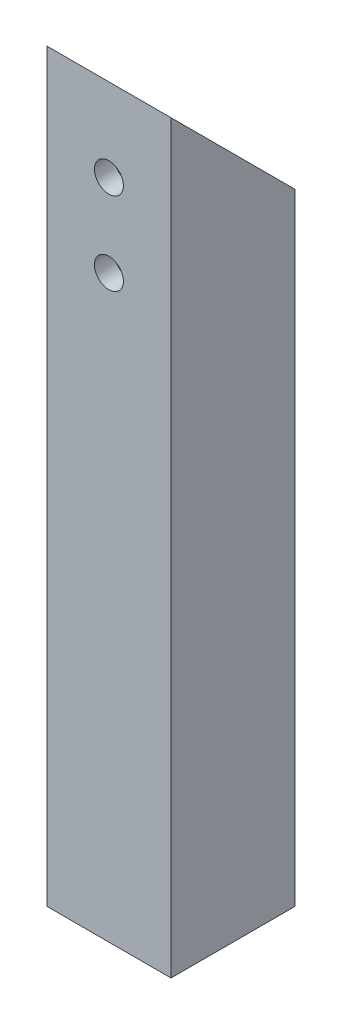
ISO-10303-21;
HEADER;
FILE_DESCRIPTION(('STEP AP214'),'2;1');
FILE_NAME('part.step','',(''),(''),'','','');
FILE_SCHEMA(('AUTOMOTIVE_DESIGN { 1 0 10303 214 1 1 1 1 }'));
ENDSEC;
DATA;
#1=APPLICATION_CONTEXT('core data for automotive mechanical design processes');
#2=APPLICATION_PROTOCOL_DEFINITION('international standard','automotive_design',2000,#1);
#3=PRODUCT_CONTEXT('',#1,'mechanical');
#4=PRODUCT('Part','Part','',(#3));
#5=PRODUCT_RELATED_PRODUCT_CATEGORY('part','',(#4));
#6=PRODUCT_DEFINITION_FORMATION('','',#4);
#7=PRODUCT_DEFINITION_CONTEXT('part definition',#1,'design');
#8=PRODUCT_DEFINITION('design','',#6,#7);
#9=PRODUCT_DEFINITION_SHAPE('','',#8);
#10=(LENGTH_UNIT() NAMED_UNIT(*) SI_UNIT(.MILLI.,.METRE.));
#11=(NAMED_UNIT(*) PLANE_ANGLE_UNIT() SI_UNIT($,.RADIAN.));
#12=(NAMED_UNIT(*) SI_UNIT($,.STERADIAN.) SOLID_ANGLE_UNIT());
#13=UNCERTAINTY_MEASURE_WITH_UNIT(LENGTH_MEASURE(1.E-05),#10,'distance_accuracy_value','');
#14=(GEOMETRIC_REPRESENTATION_CONTEXT(3) GLOBAL_UNCERTAINTY_ASSIGNED_CONTEXT((#13)) GLOBAL_UNIT_ASSIGNED_CONTEXT((#10,
#11,#12)) REPRESENTATION_CONTEXT('',''));
#15=CARTESIAN_POINT('',(0.,0.,0.));
#16=DIRECTION('',(0.,0.,1.));
#17=DIRECTION('',(1.,0.,0.));
#18=AXIS2_PLACEMENT_3D('',#15,#16,#17);
#19=CARTESIAN_POINT('',(7.5,-90.,-7.5));
#20=DIRECTION('',(1.,0.,0.));
#21=DIRECTION('',(0.,0.,-1.));
#22=AXIS2_PLACEMENT_3D('',#19,#20,#21);
#23=PLANE('',#22);
#24=DIRECTION('',(0.,1.,0.));
#25=VECTOR('',#24,1.);
#26=CARTESIAN_POINT('',(7.5,-90.,-7.5));
#27=LINE('',#26,#25);
#28=CARTESIAN_POINT('',(7.5,-90.,-7.5));
#29=VERTEX_POINT('',#28);
#30=CARTESIAN_POINT('',(7.49999999999999,-14.9999999999998,-7.5));
#31=VERTEX_POINT('',#30);
#32=EDGE_CURVE('E101',#29,#31,#27,.T.);
#33=ORIENTED_EDGE('',*,*,#32,.T.);
#34=DIRECTION('',(0.,0.707106781186543,0.707106781186552));
#35=VECTOR('',#34,1.);
#36=CARTESIAN_POINT('',(7.49999999999999,-52.4999999999995,-45.0000000000001));
#37=LINE('',#36,#35);
#38=CARTESIAN_POINT('',(7.49999999999999,0.,7.5));
#39=VERTEX_POINT('',#38);
#40=EDGE_CURVE('E149',#31,#39,#37,.T.);
#41=ORIENTED_EDGE('',*,*,#40,.T.);
#42=DIRECTION('',(0.,1.,0.));
#43=VECTOR('',#42,1.);
#44=CARTESIAN_POINT('',(7.5,-90.,7.5));
#45=LINE('',#44,#43);
#46=CARTESIAN_POINT('',(7.5,-90.,7.5));
#47=VERTEX_POINT('',#46);
#48=EDGE_CURVE('E41',#47,#39,#45,.T.);
#49=ORIENTED_EDGE('',*,*,#48,.F.);
#50=DIRECTION('',(0.,0.,-1.));
#51=VECTOR('',#50,1.);
#52=CARTESIAN_POINT('',(7.5,-90.,-7.5));
#53=LINE('',#52,#51);
#54=EDGE_CURVE('E112',#47,#29,#53,.T.);
#55=ORIENTED_EDGE('',*,*,#54,.T.);
#56=EDGE_LOOP('',(#33,#41,#49,#55));
#57=FACE_BOUND('',#56,.T.);
#58=ADVANCED_FACE('F33',(#57),#23,.T.);
#59=CARTESIAN_POINT('',(-7.5,-90.,-7.5));
#60=DIRECTION('',(-1.,0.,0.));
#61=DIRECTION('',(0.,0.,1.));
#62=AXIS2_PLACEMENT_3D('',#59,#60,#61);
#63=PLANE('',#62);
#64=DIRECTION('',(0.,1.,0.));
#65=VECTOR('',#64,1.);
#66=CARTESIAN_POINT('',(-7.5,-90.,7.5));
#67=LINE('',#66,#65);
#68=CARTESIAN_POINT('',(-7.5,-90.,7.5));
#69=VERTEX_POINT('',#68);
#70=CARTESIAN_POINT('',(-7.5,0.,7.5));
#71=VERTEX_POINT('',#70);
#72=EDGE_CURVE('E100',#69,#71,#67,.T.);
#73=ORIENTED_EDGE('',*,*,#72,.T.);
#74=DIRECTION('',(0.,-0.707106781186543,-0.707106781186552));
#75=VECTOR('',#74,1.);
#76=CARTESIAN_POINT('',(-7.50000000000001,-52.4999999999995,-45.0000000000001));
#77=LINE('',#76,#75);
#78=CARTESIAN_POINT('',(-7.50000000000001,-14.9999999999998,-7.5));
#79=VERTEX_POINT('',#78);
#80=EDGE_CURVE('E70',#71,#79,#77,.T.);
#81=ORIENTED_EDGE('',*,*,#80,.T.);
#82=DIRECTION('',(0.,1.,0.));
#83=VECTOR('',#82,1.);
#84=CARTESIAN_POINT('',(-7.5,-90.,-7.5));
#85=LINE('',#84,#83);
#86=CARTESIAN_POINT('',(-7.5,-90.,-7.5));
#87=VERTEX_POINT('',#86);
#88=EDGE_CURVE('E91',#87,#79,#85,.T.);
#89=ORIENTED_EDGE('',*,*,#88,.F.);
#90=DIRECTION('',(0.,0.,1.));
#91=VECTOR('',#90,1.);
#92=CARTESIAN_POINT('',(-7.5,-90.,-7.5));
#93=LINE('',#92,#91);
#94=EDGE_CURVE('E94',#87,#69,#93,.T.);
#95=ORIENTED_EDGE('',*,*,#94,.T.);
#96=EDGE_LOOP('',(#73,#81,#89,#95));
#97=FACE_BOUND('',#96,.T.);
#98=ADVANCED_FACE('F93',(#97),#63,.T.);
#99=CARTESIAN_POINT('',(-7.5,-90.,-7.5));
#100=DIRECTION('',(0.,0.,-1.));
#101=DIRECTION('',(-1.,0.,0.));
#102=AXIS2_PLACEMENT_3D('',#99,#100,#101);
#103=PLANE('',#102);
#104=ORIENTED_EDGE('',*,*,#88,.T.);
#105=DIRECTION('',(-1.,0.,0.));
#106=VECTOR('',#105,1.);
#107=CARTESIAN_POINT('',(83.,-14.9999999999998,-7.5));
#108=LINE('',#107,#106);
#109=EDGE_CURVE('E140',#31,#79,#108,.T.);
#110=ORIENTED_EDGE('',*,*,#109,.F.);
#111=ORIENTED_EDGE('',*,*,#32,.F.);
#112=DIRECTION('',(-1.,0.,0.));
#113=VECTOR('',#112,1.);
#114=CARTESIAN_POINT('',(-7.5,-90.,-7.5));
#115=LINE('',#114,#113);
#116=EDGE_CURVE('E106',#29,#87,#115,.T.);
#117=ORIENTED_EDGE('',*,*,#116,.T.);
#118=EDGE_LOOP('',(#104,#110,#111,#117));
#119=FACE_BOUND('',#118,.T.);
#120=ADVANCED_FACE('F110',(#119),#103,.T.);
#121=CARTESIAN_POINT('',(5.087,-83.,-5.087));
#122=DIRECTION('',(1.,0.,0.));
#123=DIRECTION('',(0.,0.,-1.));
#124=AXIS2_PLACEMENT_3D('',#121,#122,#123);
#125=PLANE('',#124);
#126=DIRECTION('',(0.,0.707106781186543,0.707106781186552));
#127=VECTOR('',#126,1.);
#128=CARTESIAN_POINT('',(5.087,-47.7934999999995,-40.2935000000001));
#129=LINE('',#128,#127);
#130=CARTESIAN_POINT('',(5.087,-12.5869999999998,-5.087));
#131=VERTEX_POINT('',#130);
#132=CARTESIAN_POINT('',(5.087,-2.41299999999997,5.087));
#133=VERTEX_POINT('',#132);
#134=EDGE_CURVE('E145',#131,#133,#129,.T.);
#135=ORIENTED_EDGE('',*,*,#134,.F.);
#136=DIRECTION('',(0.,1.,0.));
#137=VECTOR('',#136,1.);
#138=CARTESIAN_POINT('',(5.087,-83.,-5.087));
#139=LINE('',#138,#137);
#140=CARTESIAN_POINT('',(5.087,-83.,-5.087));
#141=VERTEX_POINT('',#140);
#142=EDGE_CURVE('E163',#141,#131,#139,.T.);
#143=ORIENTED_EDGE('',*,*,#142,.F.);
#144=DIRECTION('',(0.,0.,-1.));
#145=VECTOR('',#144,1.);
#146=CARTESIAN_POINT('',(5.087,-83.,-5.087));
#147=LINE('',#146,#145);
#148=CARTESIAN_POINT('',(5.087,-83.,5.087));
#149=VERTEX_POINT('',#148);
#150=EDGE_CURVE('E151',#149,#141,#147,.T.);
#151=ORIENTED_EDGE('',*,*,#150,.F.);
#152=DIRECTION('',(0.,1.,0.));
#153=VECTOR('',#152,1.);
#154=CARTESIAN_POINT('',(5.087,-83.,5.087));
#155=LINE('',#154,#153);
#156=EDGE_CURVE('E81',#149,#133,#155,.T.);
#157=ORIENTED_EDGE('',*,*,#156,.T.);
#158=EDGE_LOOP('',(#135,#143,#151,#157));
#159=FACE_BOUND('',#158,.T.);
#160=ADVANCED_FACE('F225',(#159),#125,.F.);
#161=CARTESIAN_POINT('',(-5.087,-83.,5.087));
#162=DIRECTION('',(0.,0.,1.));
#163=DIRECTION('',(1.,0.,0.));
#164=AXIS2_PLACEMENT_3D('',#161,#162,#163);
#165=PLANE('',#164);
#166=CARTESIAN_POINT('',(0.,-20.,5.08699999999999));
#167=DIRECTION('',(0.,0.,1.));
#168=DIRECTION('',(1.,0.,0.));
#169=AXIS2_PLACEMENT_3D('',#166,#167,#168);
#170=CIRCLE('',#169,1.75);
#171=CARTESIAN_POINT('',(1.75,-20.,5.08699999999999));
#172=VERTEX_POINT('',#171);
#173=EDGE_CURVE('E136',#172,#172,#170,.F.);
#174=ORIENTED_EDGE('',*,*,#173,.F.);
#175=EDGE_LOOP('',(#174));
#176=FACE_BOUND('',#175,.T.);
#177=CARTESIAN_POINT('',(0.,-10.,5.08699999999999));
#178=DIRECTION('',(0.,0.,1.));
#179=DIRECTION('',(1.,0.,0.));
#180=AXIS2_PLACEMENT_3D('',#177,#178,#179);
#181=CIRCLE('',#180,1.75);
#182=CARTESIAN_POINT('',(1.75,-10.,5.08699999999999));
#183=VERTEX_POINT('',#182);
#184=EDGE_CURVE('E128',#183,#183,#181,.F.);
#185=ORIENTED_EDGE('',*,*,#184,.F.);
#186=EDGE_LOOP('',(#185));
#187=FACE_BOUND('',#186,.T.);
#188=DIRECTION('',(-1.,0.,0.));
#189=VECTOR('',#188,1.);
#190=CARTESIAN_POINT('',(-5.087,-2.41299999999997,5.087));
#191=LINE('',#190,#189);
#192=CARTESIAN_POINT('',(-5.087,-2.41299999999996,5.087));
#193=VERTEX_POINT('',#192);
#194=EDGE_CURVE('E143',#133,#193,#191,.T.);
#195=ORIENTED_EDGE('',*,*,#194,.F.);
#196=ORIENTED_EDGE('',*,*,#156,.F.);
#197=DIRECTION('',(1.,0.,0.));
#198=VECTOR('',#197,1.);
#199=CARTESIAN_POINT('',(-5.087,-83.,5.087));
#200=LINE('',#199,#198);
#201=CARTESIAN_POINT('',(-5.087,-83.,5.087));
#202=VERTEX_POINT('',#201);
#203=EDGE_CURVE('E160',#202,#149,#200,.T.);
#204=ORIENTED_EDGE('',*,*,#203,.F.);
#205=DIRECTION('',(0.,1.,0.));
#206=VECTOR('',#205,1.);
#207=CARTESIAN_POINT('',(-5.087,-83.,5.087));
#208=LINE('',#207,#206);
#209=EDGE_CURVE('E165',#202,#193,#208,.T.);
#210=ORIENTED_EDGE('',*,*,#209,.T.);
#211=EDGE_LOOP('',(#195,#196,#204,#210));
#212=FACE_BOUND('',#211,.T.);
#213=ADVANCED_FACE('F226',(#176,#187,#212),#165,.F.);
#214=CARTESIAN_POINT('',(-5.087,-83.,-5.087));
#215=DIRECTION('',(-1.,0.,0.));
#216=DIRECTION('',(0.,0.,1.));
#217=AXIS2_PLACEMENT_3D('',#214,#215,#216);
#218=PLANE('',#217);
#219=DIRECTION('',(0.,-0.707106781186543,-0.707106781186552));
#220=VECTOR('',#219,1.);
#221=CARTESIAN_POINT('',(-5.087,-47.7934999999995,-40.2935000000001));
#222=LINE('',#221,#220);
#223=CARTESIAN_POINT('',(-5.087,-12.5869999999998,-5.087));
#224=VERTEX_POINT('',#223);
#225=EDGE_CURVE('E48',#193,#224,#222,.T.);
#226=ORIENTED_EDGE('',*,*,#225,.F.);
#227=ORIENTED_EDGE('',*,*,#209,.F.);
#228=DIRECTION('',(0.,0.,1.));
#229=VECTOR('',#228,1.);
#230=CARTESIAN_POINT('',(-5.087,-83.,-5.087));
#231=LINE('',#230,#229);
#232=CARTESIAN_POINT('',(-5.087,-83.,-5.087));
#233=VERTEX_POINT('',#232);
#234=EDGE_CURVE('E157',#233,#202,#231,.T.);
#235=ORIENTED_EDGE('',*,*,#234,.F.);
#236=DIRECTION('',(0.,1.,0.));
#237=VECTOR('',#236,1.);
#238=CARTESIAN_POINT('',(-5.087,-83.,-5.087));
#239=LINE('',#238,#237);
#240=EDGE_CURVE('E168',#233,#224,#239,.T.);
#241=ORIENTED_EDGE('',*,*,#240,.T.);
#242=EDGE_LOOP('',(#226,#227,#235,#241));
#243=FACE_BOUND('',#242,.T.);
#244=ADVANCED_FACE('F222',(#243),#218,.F.);
#245=CARTESIAN_POINT('',(-5.087,-83.,-5.087));
#246=DIRECTION('',(0.,0.,-1.));
#247=DIRECTION('',(-1.,0.,0.));
#248=AXIS2_PLACEMENT_3D('',#245,#246,#247);
#249=PLANE('',#248);
#250=DIRECTION('',(1.,0.,0.));
#251=VECTOR('',#250,1.);
#252=CARTESIAN_POINT('',(-5.087,-12.5869999999998,-5.087));
#253=LINE('',#252,#251);
#254=EDGE_CURVE('E11',#224,#131,#253,.T.);
#255=ORIENTED_EDGE('',*,*,#254,.F.);
#256=ORIENTED_EDGE('',*,*,#240,.F.);
#257=DIRECTION('',(-1.,0.,0.));
#258=VECTOR('',#257,1.);
#259=CARTESIAN_POINT('',(-5.087,-83.,-5.087));
#260=LINE('',#259,#258);
#261=EDGE_CURVE('E154',#141,#233,#260,.T.);
#262=ORIENTED_EDGE('',*,*,#261,.F.);
#263=ORIENTED_EDGE('',*,*,#142,.T.);
#264=EDGE_LOOP('',(#255,#256,#262,#263));
#265=FACE_BOUND('',#264,.T.);
#266=ADVANCED_FACE('F180',(#265),#249,.F.);
#267=CARTESIAN_POINT('',(0.,-90.,0.));
#268=DIRECTION('',(0.,1.,0.));
#269=DIRECTION('',(0.,0.,1.));
#270=AXIS2_PLACEMENT_3D('',#267,#268,#269);
#271=CYLINDRICAL_SURFACE('',#270,2.5);
#272=CARTESIAN_POINT('',(0.,-90.,0.));
#273=DIRECTION('',(0.,1.,0.));
#274=DIRECTION('',(0.,0.,1.));
#275=AXIS2_PLACEMENT_3D('',#272,#273,#274);
#276=CIRCLE('',#275,2.5);
#277=CARTESIAN_POINT('',(0.,-90.,2.5));
#278=VERTEX_POINT('',#277);
#279=EDGE_CURVE('E120',#278,#278,#276,.T.);
#280=CARTESIAN_POINT('',(0.,-83.,0.));
#281=DIRECTION('',(0.,1.,0.));
#282=DIRECTION('',(0.,0.,1.));
#283=AXIS2_PLACEMENT_3D('',#280,#281,#282);
#284=CIRCLE('',#283,2.5);
#285=CARTESIAN_POINT('',(0.,-83.,2.5));
#286=VERTEX_POINT('',#285);
#287=EDGE_CURVE('E124',#286,#286,#284,.F.);
#288=CARTESIAN_POINT('',(0.,-90.,2.5));
#289=CARTESIAN_POINT('',(0.,-89.9270833333333,2.5));
#290=CARTESIAN_POINT('',(0.,-89.8541666666667,2.5));
#291=CARTESIAN_POINT('',(0.,-89.7083333333333,2.5));
#292=CARTESIAN_POINT('',(0.,-89.6354166666667,2.5));
#293=CARTESIAN_POINT('',(0.,-89.4895833333333,2.5));
#294=CARTESIAN_POINT('',(0.,-89.4166666666667,2.5));
#295=CARTESIAN_POINT('',(0.,-89.2708333333333,2.5));
#296=CARTESIAN_POINT('',(0.,-89.1979166666667,2.5));
#297=CARTESIAN_POINT('',(0.,-89.0520833333333,2.5));
#298=CARTESIAN_POINT('',(0.,-88.9791666666667,2.5));
#299=CARTESIAN_POINT('',(0.,-88.8333333333333,2.5));
#300=CARTESIAN_POINT('',(0.,-88.7604166666667,2.5));
#301=CARTESIAN_POINT('',(0.,-88.6145833333333,2.5));
#302=CARTESIAN_POINT('',(0.,-88.5416666666667,2.5));
#303=CARTESIAN_POINT('',(0.,-88.3958333333333,2.5));
#304=CARTESIAN_POINT('',(0.,-88.3229166666667,2.5));
#305=CARTESIAN_POINT('',(0.,-88.1770833333333,2.5));
#306=CARTESIAN_POINT('',(0.,-88.1041666666667,2.5));
#307=CARTESIAN_POINT('',(0.,-87.9583333333333,2.5));
#308=CARTESIAN_POINT('',(0.,-87.8854166666667,2.5));
#309=CARTESIAN_POINT('',(0.,-87.7395833333333,2.5));
#310=CARTESIAN_POINT('',(0.,-87.6666666666667,2.5));
#311=CARTESIAN_POINT('',(0.,-87.5208333333333,2.5));
#312=CARTESIAN_POINT('',(0.,-87.4479166666667,2.5));
#313=CARTESIAN_POINT('',(0.,-87.3020833333333,2.5));
#314=CARTESIAN_POINT('',(0.,-87.2291666666667,2.5));
#315=CARTESIAN_POINT('',(0.,-87.0833333333333,2.5));
#316=CARTESIAN_POINT('',(0.,-87.0104166666667,2.5));
#317=CARTESIAN_POINT('',(0.,-86.8645833333333,2.5));
#318=CARTESIAN_POINT('',(0.,-86.7916666666667,2.5));
#319=CARTESIAN_POINT('',(0.,-86.6458333333333,2.5));
#320=CARTESIAN_POINT('',(0.,-86.5729166666667,2.5));
#321=CARTESIAN_POINT('',(0.,-86.4270833333333,2.5));
#322=CARTESIAN_POINT('',(0.,-86.3541666666667,2.5));
#323=CARTESIAN_POINT('',(0.,-86.2083333333333,2.5));
#324=CARTESIAN_POINT('',(0.,-86.1354166666667,2.5));
#325=CARTESIAN_POINT('',(0.,-85.9895833333333,2.5));
#326=CARTESIAN_POINT('',(0.,-85.9166666666667,2.5));
#327=CARTESIAN_POINT('',(0.,-85.7708333333333,2.5));
#328=CARTESIAN_POINT('',(0.,-85.6979166666667,2.5));
#329=CARTESIAN_POINT('',(0.,-85.5520833333333,2.5));
#330=CARTESIAN_POINT('',(0.,-85.4791666666667,2.5));
#331=CARTESIAN_POINT('',(0.,-85.3333333333333,2.5));
#332=CARTESIAN_POINT('',(0.,-85.2604166666667,2.5));
#333=CARTESIAN_POINT('',(0.,-85.1145833333333,2.5));
#334=CARTESIAN_POINT('',(0.,-85.0416666666667,2.5));
#335=CARTESIAN_POINT('',(0.,-84.8958333333333,2.5));
#336=CARTESIAN_POINT('',(0.,-84.8229166666667,2.5));
#337=CARTESIAN_POINT('',(0.,-84.6770833333333,2.5));
#338=CARTESIAN_POINT('',(0.,-84.6041666666667,2.5));
#339=CARTESIAN_POINT('',(0.,-84.4583333333333,2.5));
#340=CARTESIAN_POINT('',(0.,-84.3854166666667,2.5));
#341=CARTESIAN_POINT('',(0.,-84.2395833333333,2.5));
#342=CARTESIAN_POINT('',(0.,-84.1666666666667,2.5));
#343=CARTESIAN_POINT('',(0.,-84.0208333333333,2.5));
#344=CARTESIAN_POINT('',(0.,-83.9479166666667,2.5));
#345=CARTESIAN_POINT('',(0.,-83.8020833333333,2.5));
#346=CARTESIAN_POINT('',(0.,-83.7291666666667,2.5));
#347=CARTESIAN_POINT('',(0.,-83.5833333333333,2.5));
#348=CARTESIAN_POINT('',(0.,-83.5104166666667,2.5));
#349=CARTESIAN_POINT('',(0.,-83.3645833333333,2.5));
#350=CARTESIAN_POINT('',(0.,-83.2916666666667,2.5));
#351=CARTESIAN_POINT('',(0.,-83.1458333333333,2.5));
#352=CARTESIAN_POINT('',(0.,-83.0729166666667,2.5));
#353=CARTESIAN_POINT('',(0.,-83.,2.5));
#354=B_SPLINE_CURVE_WITH_KNOTS('',3,(#288,#289,#290,#291,#292,#293,#294,#295,#296,#297,#298,
#299,#300,#301,#302,#303,#304,#305,#306,#307,#308,#309,#310,#311,#312,#313,#314,#315,#316,#317,
#318,#319,#320,#321,#322,#323,#324,#325,#326,#327,#328,#329,#330,#331,#332,#333,#334,#335,#336,
#337,#338,#339,#340,#341,#342,#343,#344,#345,#346,#347,#348,#349,#350,#351,#352,#353),
.UNSPECIFIED.,.F.,.F.,(4,2,2,2,2,2,2,2,2,2,2,2,2,2,2,2,2,2,2,2,2,2,2,2,2,2,2,2,2,2,2,2,4),(0.,
0.218750000000004,0.437500000000007,0.656250000000011,0.875000000000001,1.09375,
1.31250000000001,1.53125000000001,1.75,1.96875000000001,2.18750000000001,2.40625,2.625,
2.84375000000001,3.06250000000001,3.28125,3.5,3.71875000000001,3.9375,4.15625,4.375,
4.59375000000001,4.8125,5.03125,5.25,5.46875000000001,5.6875,5.90625,6.12500000000001,6.34375,
6.5625,6.78125,7.00000000000001),.UNSPECIFIED.);
#355=EDGE_CURVE('BSEAM176',#278,#286,#354,.T.);
#356=ORIENTED_EDGE('',*,*,#279,.F.);
#357=ORIENTED_EDGE('',*,*,#287,.F.);
#358=ORIENTED_EDGE('',*,*,#355,.T.);
#359=ORIENTED_EDGE('',*,*,#355,.F.);
#360=EDGE_LOOP('',(#356,#358,#357,#359));
#361=FACE_BOUND('',#360,.T.);
#362=ADVANCED_FACE('F176',(#361),#271,.F.);
#363=CARTESIAN_POINT('',(-7.5,-90.,7.5));
#364=DIRECTION('',(0.,0.,1.));
#365=DIRECTION('',(1.,0.,0.));
#366=AXIS2_PLACEMENT_3D('',#363,#364,#365);
#367=PLANE('',#366);
#368=CARTESIAN_POINT('',(0.,-20.,7.49999999999999));
#369=DIRECTION('',(0.,0.,1.));
#370=DIRECTION('',(1.,0.,0.));
#371=AXIS2_PLACEMENT_3D('',#368,#369,#370);
#372=CIRCLE('',#371,1.75);
#373=CARTESIAN_POINT('',(1.75,-20.,7.49999999999999));
#374=VERTEX_POINT('',#373);
#375=EDGE_CURVE('E36',#374,#374,#372,.F.);
#376=ORIENTED_EDGE('',*,*,#375,.T.);
#377=EDGE_LOOP('',(#376));
#378=FACE_BOUND('',#377,.T.);
#379=CARTESIAN_POINT('',(0.,-10.,7.49999999999999));
#380=DIRECTION('',(0.,0.,1.));
#381=DIRECTION('',(1.,0.,0.));
#382=AXIS2_PLACEMENT_3D('',#379,#380,#381);
#383=CIRCLE('',#382,1.75);
#384=CARTESIAN_POINT('',(1.75,-10.,7.49999999999999));
#385=VERTEX_POINT('',#384);
#386=EDGE_CURVE('E126',#385,#385,#383,.F.);
#387=ORIENTED_EDGE('',*,*,#386,.T.);
#388=EDGE_LOOP('',(#387));
#389=FACE_BOUND('',#388,.T.);
#390=DIRECTION('',(1.,0.,0.));
#391=VECTOR('',#390,1.);
#392=CARTESIAN_POINT('',(-7.5,0.,7.5));
#393=LINE('',#392,#391);
#394=EDGE_CURVE('E114',#71,#39,#393,.T.);
#395=ORIENTED_EDGE('',*,*,#394,.F.);
#396=ORIENTED_EDGE('',*,*,#72,.F.);
#397=DIRECTION('',(1.,0.,0.));
#398=VECTOR('',#397,1.);
#399=CARTESIAN_POINT('',(-7.5,-90.,7.5));
#400=LINE('',#399,#398);
#401=EDGE_CURVE('E108',#69,#47,#400,.T.);
#402=ORIENTED_EDGE('',*,*,#401,.T.);
#403=ORIENTED_EDGE('',*,*,#48,.T.);
#404=EDGE_LOOP('',(#395,#396,#402,#403));
#405=FACE_BOUND('',#404,.T.);
#406=ADVANCED_FACE('F179',(#378,#389,#405),#367,.T.);
#407=CARTESIAN_POINT('',(0.,-90.,0.));
#408=DIRECTION('',(0.,1.,0.));
#409=DIRECTION('',(0.,0.,1.));
#410=AXIS2_PLACEMENT_3D('',#407,#408,#409);
#411=PLANE('',#410);
#412=ORIENTED_EDGE('',*,*,#279,.T.);
#413=EDGE_LOOP('',(#412));
#414=FACE_BOUND('',#413,.T.);
#415=ORIENTED_EDGE('',*,*,#54,.F.);
#416=ORIENTED_EDGE('',*,*,#401,.F.);
#417=ORIENTED_EDGE('',*,*,#94,.F.);
#418=ORIENTED_EDGE('',*,*,#116,.F.);
#419=EDGE_LOOP('',(#415,#416,#417,#418));
#420=FACE_BOUND('',#419,.T.);
#421=ADVANCED_FACE('F105',(#414,#420),#411,.F.);
#422=CARTESIAN_POINT('',(0.,-83.,0.));
#423=DIRECTION('',(0.,1.,0.));
#424=DIRECTION('',(0.,0.,1.));
#425=AXIS2_PLACEMENT_3D('',#422,#423,#424);
#426=PLANE('',#425);
#427=ORIENTED_EDGE('',*,*,#150,.T.);
#428=ORIENTED_EDGE('',*,*,#261,.T.);
#429=ORIENTED_EDGE('',*,*,#234,.T.);
#430=ORIENTED_EDGE('',*,*,#203,.T.);
#431=EDGE_LOOP('',(#427,#428,#429,#430));
#432=FACE_BOUND('',#431,.T.);
#433=ORIENTED_EDGE('',*,*,#287,.T.);
#434=EDGE_LOOP('',(#433));
#435=FACE_BOUND('',#434,.T.);
#436=ADVANCED_FACE('F184',(#432,#435),#426,.T.);
#437=CARTESIAN_POINT('',(83.,0.,7.5));
#438=DIRECTION('',(0.,0.707106781186552,-0.707106781186543));
#439=DIRECTION('',(0.,0.707106781186543,0.707106781186552));
#440=AXIS2_PLACEMENT_3D('',#437,#438,#439);
#441=PLANE('',#440);
#442=ORIENTED_EDGE('',*,*,#109,.T.);
#443=ORIENTED_EDGE('',*,*,#80,.F.);
#444=ORIENTED_EDGE('',*,*,#394,.T.);
#445=ORIENTED_EDGE('',*,*,#40,.F.);
#446=EDGE_LOOP('',(#442,#443,#444,#445));
#447=FACE_BOUND('',#446,.T.);
#448=ORIENTED_EDGE('',*,*,#134,.T.);
#449=ORIENTED_EDGE('',*,*,#194,.T.);
#450=ORIENTED_EDGE('',*,*,#225,.T.);
#451=ORIENTED_EDGE('',*,*,#254,.T.);
#452=EDGE_LOOP('',(#448,#449,#450,#451));
#453=FACE_BOUND('',#452,.T.);
#454=ADVANCED_FACE('F186',(#447,#453),#441,.T.);
#455=CARTESIAN_POINT('',(0.,-10.,83.));
#456=DIRECTION('',(0.,0.,-1.));
#457=DIRECTION('',(-1.,0.,0.));
#458=AXIS2_PLACEMENT_3D('',#455,#456,#457);
#459=CYLINDRICAL_SURFACE('',#458,1.75);
#460=ORIENTED_EDGE('',*,*,#386,.F.);
#461=EDGE_LOOP('',(#460));
#462=FACE_BOUND('',#461,.T.);
#463=ORIENTED_EDGE('',*,*,#184,.T.);
#464=EDGE_LOOP('',(#463));
#465=FACE_BOUND('',#464,.T.);
#466=ADVANCED_FACE('F193',(#462,#465),#459,.F.);
#467=CARTESIAN_POINT('',(0.,-20.,83.));
#468=DIRECTION('',(0.,0.,-1.));
#469=DIRECTION('',(-1.,0.,0.));
#470=AXIS2_PLACEMENT_3D('',#467,#468,#469);
#471=CYLINDRICAL_SURFACE('',#470,1.75);
#472=ORIENTED_EDGE('',*,*,#375,.F.);
#473=EDGE_LOOP('',(#472));
#474=FACE_BOUND('',#473,.T.);
#475=ORIENTED_EDGE('',*,*,#173,.T.);
#476=EDGE_LOOP('',(#475));
#477=FACE_BOUND('',#476,.T.);
#478=ADVANCED_FACE('F291',(#474,#477),#471,.F.);
#479=CLOSED_SHELL('',(#58,#98,#120,#160,#213,#244,#266,#362,#406,#421,#436,#454,#466,#478));
#480=MANIFOLD_SOLID_BREP('B2',#479);
#481=ADVANCED_BREP_SHAPE_REPRESENTATION('',(#18,#480),#14);
#482=SHAPE_DEFINITION_REPRESENTATION(#9,#481);
ENDSEC;
END-ISO-10303-21;
